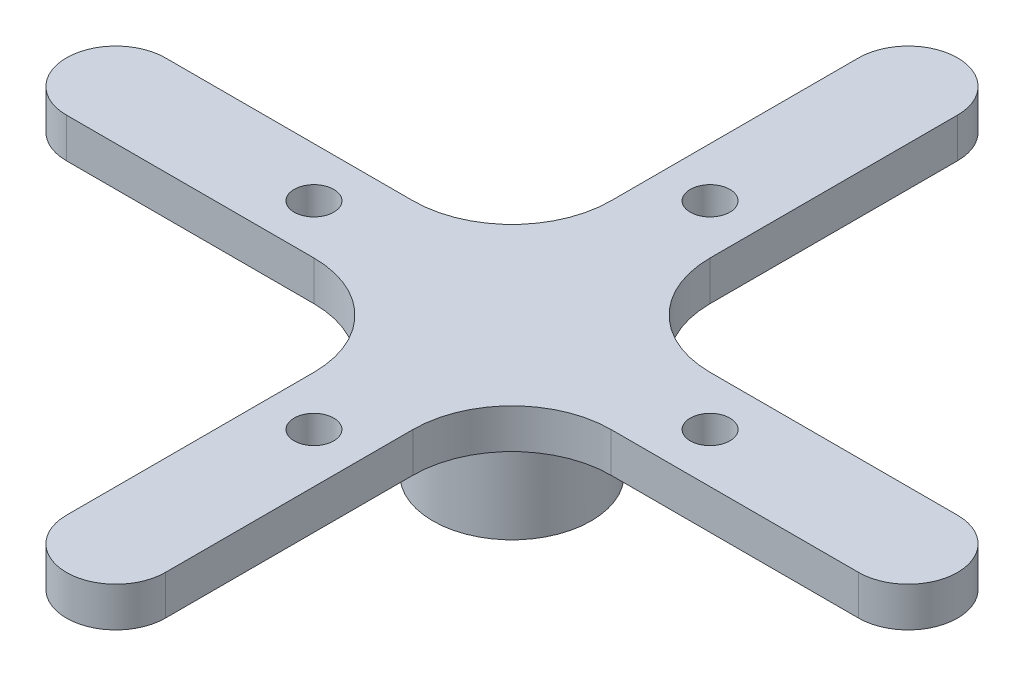
ISO-10303-21;
HEADER;
FILE_DESCRIPTION(('STEP AP214'),'2;1');
FILE_NAME('part.step','',(''),(''),'','','');
FILE_SCHEMA(('AUTOMOTIVE_DESIGN { 1 0 10303 214 1 1 1 1 }'));
ENDSEC;
DATA;
#1=APPLICATION_CONTEXT('core data for automotive mechanical design processes');
#2=APPLICATION_PROTOCOL_DEFINITION('international standard','automotive_design',2000,#1);
#3=PRODUCT_CONTEXT('',#1,'mechanical');
#4=PRODUCT('Part','Part','',(#3));
#5=PRODUCT_RELATED_PRODUCT_CATEGORY('part','',(#4));
#6=PRODUCT_DEFINITION_FORMATION('','',#4);
#7=PRODUCT_DEFINITION_CONTEXT('part definition',#1,'design');
#8=PRODUCT_DEFINITION('design','',#6,#7);
#9=PRODUCT_DEFINITION_SHAPE('','',#8);
#10=(LENGTH_UNIT() NAMED_UNIT(*) SI_UNIT(.MILLI.,.METRE.));
#11=(NAMED_UNIT(*) PLANE_ANGLE_UNIT() SI_UNIT($,.RADIAN.));
#12=(NAMED_UNIT(*) SI_UNIT($,.STERADIAN.) SOLID_ANGLE_UNIT());
#13=UNCERTAINTY_MEASURE_WITH_UNIT(LENGTH_MEASURE(1.E-05),#10,'distance_accuracy_value','');
#14=(GEOMETRIC_REPRESENTATION_CONTEXT(3) GLOBAL_UNCERTAINTY_ASSIGNED_CONTEXT((#13)) GLOBAL_UNIT_ASSIGNED_CONTEXT((#10,
#11,#12)) REPRESENTATION_CONTEXT('',''));
#15=CARTESIAN_POINT('',(0.,0.,0.));
#16=DIRECTION('',(0.,0.,1.));
#17=DIRECTION('',(1.,0.,0.));
#18=AXIS2_PLACEMENT_3D('',#15,#16,#17);
#19=CARTESIAN_POINT('',(-20.,0.,0.));
#20=DIRECTION('',(0.,1.,0.));
#21=DIRECTION('',(0.,0.,1.));
#22=AXIS2_PLACEMENT_3D('',#19,#20,#21);
#23=PLANE('',#22);
#24=CARTESIAN_POINT('',(0.,0.,-10.));
#25=DIRECTION('',(0.,1.,0.));
#26=DIRECTION('',(0.,0.,1.));
#27=AXIS2_PLACEMENT_3D('',#24,#25,#26);
#28=CIRCLE('',#27,1.);
#29=CARTESIAN_POINT('',(0.,0.,-9.));
#30=VERTEX_POINT('',#29);
#31=EDGE_CURVE('E511',#30,#30,#28,.T.);
#32=ORIENTED_EDGE('',*,*,#31,.T.);
#33=EDGE_LOOP('',(#32));
#34=FACE_BOUND('',#33,.T.);
#35=CARTESIAN_POINT('',(10.,0.,0.));
#36=DIRECTION('',(0.,1.,0.));
#37=DIRECTION('',(0.,0.,1.));
#38=AXIS2_PLACEMENT_3D('',#35,#36,#37);
#39=CIRCLE('',#38,1.);
#40=CARTESIAN_POINT('',(10.,0.,1.));
#41=VERTEX_POINT('',#40);
#42=EDGE_CURVE('E522',#41,#41,#39,.T.);
#43=ORIENTED_EDGE('',*,*,#42,.T.);
#44=EDGE_LOOP('',(#43));
#45=FACE_BOUND('',#44,.T.);
#46=CARTESIAN_POINT('',(-20.,0.,0.));
#47=DIRECTION('',(0.,1.,0.));
#48=DIRECTION('',(0.,0.,1.));
#49=AXIS2_PLACEMENT_3D('',#46,#47,#48);
#50=CIRCLE('',#49,2.5);
#51=CARTESIAN_POINT('',(-20.,0.,-2.5));
#52=VERTEX_POINT('',#51);
#53=CARTESIAN_POINT('',(-20.,0.,2.5));
#54=VERTEX_POINT('',#53);
#55=EDGE_CURVE('E389',#52,#54,#50,.T.);
#56=ORIENTED_EDGE('',*,*,#55,.F.);
#57=DIRECTION('',(1.,0.,0.));
#58=VECTOR('',#57,1.);
#59=CARTESIAN_POINT('',(-20.,0.,-2.5));
#60=LINE('',#59,#58);
#61=CARTESIAN_POINT('',(-7.50000000000004,0.,-2.5));
#62=VERTEX_POINT('',#61);
#63=EDGE_CURVE('E430',#52,#62,#60,.T.);
#64=ORIENTED_EDGE('',*,*,#63,.T.);
#65=CARTESIAN_POINT('',(-7.5,0.,-7.5));
#66=DIRECTION('',(0.,1.,0.));
#67=DIRECTION('',(0.,0.,1.));
#68=AXIS2_PLACEMENT_3D('',#65,#66,#67);
#69=CIRCLE('',#68,5.);
#70=CARTESIAN_POINT('',(-2.5,0.,-7.50000000000003));
#71=VERTEX_POINT('',#70);
#72=EDGE_CURVE('E428',#62,#71,#69,.T.);
#73=ORIENTED_EDGE('',*,*,#72,.T.);
#74=DIRECTION('',(0.,0.,1.));
#75=VECTOR('',#74,1.);
#76=CARTESIAN_POINT('',(-2.5,0.,-20.));
#77=LINE('',#76,#75);
#78=CARTESIAN_POINT('',(-2.5,0.,-20.));
#79=VERTEX_POINT('',#78);
#80=EDGE_CURVE('E378',#79,#71,#77,.T.);
#81=ORIENTED_EDGE('',*,*,#80,.F.);
#82=CARTESIAN_POINT('',(0.,0.,-20.));
#83=DIRECTION('',(0.,-1.,0.));
#84=DIRECTION('',(0.,0.,-1.));
#85=AXIS2_PLACEMENT_3D('',#82,#83,#84);
#86=CIRCLE('',#85,2.5);
#87=CARTESIAN_POINT('',(2.5,0.,-20.));
#88=VERTEX_POINT('',#87);
#89=EDGE_CURVE('E424',#79,#88,#86,.T.);
#90=ORIENTED_EDGE('',*,*,#89,.T.);
#91=DIRECTION('',(0.,0.,1.));
#92=VECTOR('',#91,1.);
#93=CARTESIAN_POINT('',(2.5,0.,-20.));
#94=LINE('',#93,#92);
#95=CARTESIAN_POINT('',(2.50000000000001,0.,-7.50000000000002));
#96=VERTEX_POINT('',#95);
#97=EDGE_CURVE('E421',#88,#96,#94,.T.);
#98=ORIENTED_EDGE('',*,*,#97,.T.);
#99=CARTESIAN_POINT('',(7.5,0.,-7.5));
#100=DIRECTION('',(0.,1.,0.));
#101=DIRECTION('',(0.,0.,1.));
#102=AXIS2_PLACEMENT_3D('',#99,#100,#101);
#103=CIRCLE('',#102,4.99999999999999);
#104=CARTESIAN_POINT('',(7.49999999999999,0.,-2.50000000000001));
#105=VERTEX_POINT('',#104);
#106=EDGE_CURVE('E418',#96,#105,#103,.T.);
#107=ORIENTED_EDGE('',*,*,#106,.T.);
#108=DIRECTION('',(1.,0.,0.));
#109=VECTOR('',#108,1.);
#110=CARTESIAN_POINT('',(7.49999999999999,0.,-2.50000000000001));
#111=LINE('',#110,#109);
#112=CARTESIAN_POINT('',(20.,0.,-2.5));
#113=VERTEX_POINT('',#112);
#114=EDGE_CURVE('E415',#105,#113,#111,.T.);
#115=ORIENTED_EDGE('',*,*,#114,.T.);
#116=CARTESIAN_POINT('',(20.,0.,0.));
#117=DIRECTION('',(0.,-1.,0.));
#118=DIRECTION('',(0.,0.,-1.));
#119=AXIS2_PLACEMENT_3D('',#116,#117,#118);
#120=CIRCLE('',#119,2.5);
#121=CARTESIAN_POINT('',(20.,0.,2.5));
#122=VERTEX_POINT('',#121);
#123=EDGE_CURVE('E412',#113,#122,#120,.T.);
#124=ORIENTED_EDGE('',*,*,#123,.T.);
#125=DIRECTION('',(1.,0.,0.));
#126=VECTOR('',#125,1.);
#127=CARTESIAN_POINT('',(7.50000000000004,0.,2.5));
#128=LINE('',#127,#126);
#129=CARTESIAN_POINT('',(7.50000000000004,0.,2.5));
#130=VERTEX_POINT('',#129);
#131=EDGE_CURVE('E409',#130,#122,#128,.T.);
#132=ORIENTED_EDGE('',*,*,#131,.F.);
#133=CARTESIAN_POINT('',(7.5,0.,7.5));
#134=DIRECTION('',(0.,1.,0.));
#135=DIRECTION('',(0.,0.,1.));
#136=AXIS2_PLACEMENT_3D('',#133,#134,#135);
#137=CIRCLE('',#136,5.);
#138=CARTESIAN_POINT('',(2.5,0.,7.50000000000004));
#139=VERTEX_POINT('',#138);
#140=EDGE_CURVE('E406',#130,#139,#137,.T.);
#141=ORIENTED_EDGE('',*,*,#140,.T.);
#142=DIRECTION('',(0.,0.,1.));
#143=VECTOR('',#142,1.);
#144=CARTESIAN_POINT('',(2.5,0.,7.50000000000004));
#145=LINE('',#144,#143);
#146=CARTESIAN_POINT('',(2.5,0.,20.));
#147=VERTEX_POINT('',#146);
#148=EDGE_CURVE('E403',#139,#147,#145,.T.);
#149=ORIENTED_EDGE('',*,*,#148,.T.);
#150=CARTESIAN_POINT('',(0.,0.,20.));
#151=DIRECTION('',(0.,1.,0.));
#152=DIRECTION('',(0.,0.,1.));
#153=AXIS2_PLACEMENT_3D('',#150,#151,#152);
#154=CIRCLE('',#153,2.5);
#155=CARTESIAN_POINT('',(-2.5,0.,20.));
#156=VERTEX_POINT('',#155);
#157=EDGE_CURVE('E400',#156,#147,#154,.T.);
#158=ORIENTED_EDGE('',*,*,#157,.F.);
#159=DIRECTION('',(0.,0.,1.));
#160=VECTOR('',#159,1.);
#161=CARTESIAN_POINT('',(-2.5,0.,7.50000000000003));
#162=LINE('',#161,#160);
#163=CARTESIAN_POINT('',(-2.5,0.,7.50000000000003));
#164=VERTEX_POINT('',#163);
#165=EDGE_CURVE('E398',#164,#156,#162,.T.);
#166=ORIENTED_EDGE('',*,*,#165,.F.);
#167=CARTESIAN_POINT('',(-7.5,0.,7.5));
#168=DIRECTION('',(0.,1.,0.));
#169=DIRECTION('',(0.,0.,1.));
#170=AXIS2_PLACEMENT_3D('',#167,#168,#169);
#171=CIRCLE('',#170,5.);
#172=CARTESIAN_POINT('',(-7.50000000000004,0.,2.5));
#173=VERTEX_POINT('',#172);
#174=EDGE_CURVE('E395',#164,#173,#171,.T.);
#175=ORIENTED_EDGE('',*,*,#174,.T.);
#176=DIRECTION('',(1.,0.,0.));
#177=VECTOR('',#176,1.);
#178=CARTESIAN_POINT('',(-20.,0.,2.5));
#179=LINE('',#178,#177);
#180=EDGE_CURVE('E391',#54,#173,#179,.T.);
#181=ORIENTED_EDGE('',*,*,#180,.F.);
#182=EDGE_LOOP('',(#56,#64,#73,#81,#90,#98,#107,#115,#124,#132,#141,#149,#158,#166,#175,#181));
#183=FACE_BOUND('',#182,.T.);
#184=CARTESIAN_POINT('',(0.,0.,10.));
#185=DIRECTION('',(0.,1.,0.));
#186=DIRECTION('',(0.,0.,1.));
#187=AXIS2_PLACEMENT_3D('',#184,#185,#186);
#188=CIRCLE('',#187,1.);
#189=CARTESIAN_POINT('',(0.,0.,11.));
#190=VERTEX_POINT('',#189);
#191=EDGE_CURVE('E517',#190,#190,#188,.T.);
#192=ORIENTED_EDGE('',*,*,#191,.T.);
#193=EDGE_LOOP('',(#192));
#194=FACE_BOUND('',#193,.T.);
#195=CARTESIAN_POINT('',(-10.,0.,0.));
#196=DIRECTION('',(0.,1.,0.));
#197=DIRECTION('',(0.,0.,1.));
#198=AXIS2_PLACEMENT_3D('',#195,#196,#197);
#199=CIRCLE('',#198,1.);
#200=CARTESIAN_POINT('',(-10.,0.,1.));
#201=VERTEX_POINT('',#200);
#202=EDGE_CURVE('E507',#201,#201,#199,.T.);
#203=ORIENTED_EDGE('',*,*,#202,.T.);
#204=EDGE_LOOP('',(#203));
#205=FACE_BOUND('',#204,.T.);
#206=CARTESIAN_POINT('',(0.,0.,0.));
#207=DIRECTION('',(0.,1.,0.));
#208=DIRECTION('',(0.,0.,1.));
#209=AXIS2_PLACEMENT_3D('',#206,#207,#208);
#210=CIRCLE('',#209,4.);
#211=CARTESIAN_POINT('',(0.,0.,4.));
#212=VERTEX_POINT('',#211);
#213=EDGE_CURVE('E12',#212,#212,#210,.F.);
#214=ORIENTED_EDGE('',*,*,#213,.F.);
#215=EDGE_LOOP('',(#214));
#216=FACE_BOUND('',#215,.T.);
#217=ADVANCED_FACE('F241',(#34,#45,#183,#194,#205,#216),#23,.F.);
#218=CARTESIAN_POINT('',(-20.,2.,0.));
#219=DIRECTION('',(0.,1.,0.));
#220=DIRECTION('',(0.,0.,1.));
#221=AXIS2_PLACEMENT_3D('',#218,#219,#220);
#222=PLANE('',#221);
#223=CARTESIAN_POINT('',(0.,2.,-10.));
#224=DIRECTION('',(0.,1.,0.));
#225=DIRECTION('',(0.,0.,1.));
#226=AXIS2_PLACEMENT_3D('',#223,#224,#225);
#227=CIRCLE('',#226,1.);
#228=CARTESIAN_POINT('',(0.,2.,-9.));
#229=VERTEX_POINT('',#228);
#230=EDGE_CURVE('E514',#229,#229,#227,.T.);
#231=ORIENTED_EDGE('',*,*,#230,.F.);
#232=EDGE_LOOP('',(#231));
#233=FACE_BOUND('',#232,.T.);
#234=CARTESIAN_POINT('',(10.,2.,0.));
#235=DIRECTION('',(0.,1.,0.));
#236=DIRECTION('',(0.,0.,1.));
#237=AXIS2_PLACEMENT_3D('',#234,#235,#236);
#238=CIRCLE('',#237,1.);
#239=CARTESIAN_POINT('',(10.,2.,1.));
#240=VERTEX_POINT('',#239);
#241=EDGE_CURVE('E392',#240,#240,#238,.T.);
#242=ORIENTED_EDGE('',*,*,#241,.F.);
#243=EDGE_LOOP('',(#242));
#244=FACE_BOUND('',#243,.T.);
#245=CARTESIAN_POINT('',(-20.,2.,0.));
#246=DIRECTION('',(0.,1.,0.));
#247=DIRECTION('',(0.,0.,1.));
#248=AXIS2_PLACEMENT_3D('',#245,#246,#247);
#249=CIRCLE('',#248,2.5);
#250=CARTESIAN_POINT('',(-20.,2.,-2.5));
#251=VERTEX_POINT('',#250);
#252=CARTESIAN_POINT('',(-20.,2.,2.5));
#253=VERTEX_POINT('',#252);
#254=EDGE_CURVE('E433',#251,#253,#249,.T.);
#255=ORIENTED_EDGE('',*,*,#254,.T.);
#256=DIRECTION('',(1.,0.,0.));
#257=VECTOR('',#256,1.);
#258=CARTESIAN_POINT('',(-20.,2.,2.5));
#259=LINE('',#258,#257);
#260=CARTESIAN_POINT('',(-7.50000000000004,2.,2.5));
#261=VERTEX_POINT('',#260);
#262=EDGE_CURVE('E321',#253,#261,#259,.T.);
#263=ORIENTED_EDGE('',*,*,#262,.T.);
#264=CARTESIAN_POINT('',(-7.5,2.,7.5));
#265=DIRECTION('',(0.,1.,0.));
#266=DIRECTION('',(0.,0.,1.));
#267=AXIS2_PLACEMENT_3D('',#264,#265,#266);
#268=CIRCLE('',#267,5.);
#269=CARTESIAN_POINT('',(-2.5,2.,7.50000000000003));
#270=VERTEX_POINT('',#269);
#271=EDGE_CURVE('E531',#270,#261,#268,.T.);
#272=ORIENTED_EDGE('',*,*,#271,.F.);
#273=DIRECTION('',(0.,0.,1.));
#274=VECTOR('',#273,1.);
#275=CARTESIAN_POINT('',(-2.5,2.,7.50000000000003));
#276=LINE('',#275,#274);
#277=CARTESIAN_POINT('',(-2.5,2.,20.));
#278=VERTEX_POINT('',#277);
#279=EDGE_CURVE('E534',#270,#278,#276,.T.);
#280=ORIENTED_EDGE('',*,*,#279,.T.);
#281=CARTESIAN_POINT('',(0.,2.,20.));
#282=DIRECTION('',(0.,1.,0.));
#283=DIRECTION('',(0.,0.,1.));
#284=AXIS2_PLACEMENT_3D('',#281,#282,#283);
#285=CIRCLE('',#284,2.5);
#286=CARTESIAN_POINT('',(2.5,2.,20.));
#287=VERTEX_POINT('',#286);
#288=EDGE_CURVE('E536',#278,#287,#285,.T.);
#289=ORIENTED_EDGE('',*,*,#288,.T.);
#290=DIRECTION('',(0.,0.,1.));
#291=VECTOR('',#290,1.);
#292=CARTESIAN_POINT('',(2.5,2.,7.50000000000004));
#293=LINE('',#292,#291);
#294=CARTESIAN_POINT('',(2.5,2.,7.50000000000004));
#295=VERTEX_POINT('',#294);
#296=EDGE_CURVE('E538',#295,#287,#293,.T.);
#297=ORIENTED_EDGE('',*,*,#296,.F.);
#298=CARTESIAN_POINT('',(7.5,2.,7.5));
#299=DIRECTION('',(0.,1.,0.));
#300=DIRECTION('',(0.,0.,1.));
#301=AXIS2_PLACEMENT_3D('',#298,#299,#300);
#302=CIRCLE('',#301,5.);
#303=CARTESIAN_POINT('',(7.50000000000004,2.,2.5));
#304=VERTEX_POINT('',#303);
#305=EDGE_CURVE('E541',#304,#295,#302,.T.);
#306=ORIENTED_EDGE('',*,*,#305,.F.);
#307=DIRECTION('',(1.,0.,0.));
#308=VECTOR('',#307,1.);
#309=CARTESIAN_POINT('',(7.50000000000004,2.,2.5));
#310=LINE('',#309,#308);
#311=CARTESIAN_POINT('',(20.,2.,2.5));
#312=VERTEX_POINT('',#311);
#313=EDGE_CURVE('E544',#304,#312,#310,.T.);
#314=ORIENTED_EDGE('',*,*,#313,.T.);
#315=CARTESIAN_POINT('',(20.,2.,0.));
#316=DIRECTION('',(0.,-1.,0.));
#317=DIRECTION('',(0.,0.,-1.));
#318=AXIS2_PLACEMENT_3D('',#315,#316,#317);
#319=CIRCLE('',#318,2.5);
#320=CARTESIAN_POINT('',(20.,2.,-2.5));
#321=VERTEX_POINT('',#320);
#322=EDGE_CURVE('E546',#321,#312,#319,.T.);
#323=ORIENTED_EDGE('',*,*,#322,.F.);
#324=DIRECTION('',(1.,0.,0.));
#325=VECTOR('',#324,1.);
#326=CARTESIAN_POINT('',(7.49999999999999,2.,-2.50000000000001));
#327=LINE('',#326,#325);
#328=CARTESIAN_POINT('',(7.49999999999999,2.,-2.50000000000001));
#329=VERTEX_POINT('',#328);
#330=EDGE_CURVE('E549',#329,#321,#327,.T.);
#331=ORIENTED_EDGE('',*,*,#330,.F.);
#332=CARTESIAN_POINT('',(7.5,2.,-7.5));
#333=DIRECTION('',(0.,1.,0.));
#334=DIRECTION('',(0.,0.,1.));
#335=AXIS2_PLACEMENT_3D('',#332,#333,#334);
#336=CIRCLE('',#335,4.99999999999999);
#337=CARTESIAN_POINT('',(2.50000000000001,2.,-7.50000000000002));
#338=VERTEX_POINT('',#337);
#339=EDGE_CURVE('E552',#338,#329,#336,.T.);
#340=ORIENTED_EDGE('',*,*,#339,.F.);
#341=DIRECTION('',(0.,0.,1.));
#342=VECTOR('',#341,1.);
#343=CARTESIAN_POINT('',(2.5,2.,-20.));
#344=LINE('',#343,#342);
#345=CARTESIAN_POINT('',(2.5,2.,-20.));
#346=VERTEX_POINT('',#345);
#347=EDGE_CURVE('E555',#346,#338,#344,.T.);
#348=ORIENTED_EDGE('',*,*,#347,.F.);
#349=CARTESIAN_POINT('',(0.,2.,-20.));
#350=DIRECTION('',(0.,-1.,0.));
#351=DIRECTION('',(0.,0.,-1.));
#352=AXIS2_PLACEMENT_3D('',#349,#350,#351);
#353=CIRCLE('',#352,2.5);
#354=CARTESIAN_POINT('',(-2.5,2.,-20.));
#355=VERTEX_POINT('',#354);
#356=EDGE_CURVE('E371',#355,#346,#353,.T.);
#357=ORIENTED_EDGE('',*,*,#356,.F.);
#358=DIRECTION('',(0.,0.,1.));
#359=VECTOR('',#358,1.);
#360=CARTESIAN_POINT('',(-2.5,2.,-20.));
#361=LINE('',#360,#359);
#362=CARTESIAN_POINT('',(-2.5,2.,-7.50000000000003));
#363=VERTEX_POINT('',#362);
#364=EDGE_CURVE('E362',#355,#363,#361,.T.);
#365=ORIENTED_EDGE('',*,*,#364,.T.);
#366=CARTESIAN_POINT('',(-7.5,2.,-7.5));
#367=DIRECTION('',(0.,1.,0.));
#368=DIRECTION('',(0.,0.,1.));
#369=AXIS2_PLACEMENT_3D('',#366,#367,#368);
#370=CIRCLE('',#369,5.);
#371=CARTESIAN_POINT('',(-7.50000000000004,2.,-2.5));
#372=VERTEX_POINT('',#371);
#373=EDGE_CURVE('E368',#372,#363,#370,.T.);
#374=ORIENTED_EDGE('',*,*,#373,.F.);
#375=DIRECTION('',(1.,0.,0.));
#376=VECTOR('',#375,1.);
#377=CARTESIAN_POINT('',(-20.,2.,-2.5));
#378=LINE('',#377,#376);
#379=EDGE_CURVE('E384',#251,#372,#378,.T.);
#380=ORIENTED_EDGE('',*,*,#379,.F.);
#381=EDGE_LOOP('',(#255,#263,#272,#280,#289,#297,#306,#314,#323,#331,#340,#348,#357,#365,#374,#380));
#382=FACE_BOUND('',#381,.T.);
#383=CARTESIAN_POINT('',(0.,2.,10.));
#384=DIRECTION('',(0.,1.,0.));
#385=DIRECTION('',(0.,0.,1.));
#386=AXIS2_PLACEMENT_3D('',#383,#384,#385);
#387=CIRCLE('',#386,1.);
#388=CARTESIAN_POINT('',(0.,2.,11.));
#389=VERTEX_POINT('',#388);
#390=EDGE_CURVE('E519',#389,#389,#387,.T.);
#391=ORIENTED_EDGE('',*,*,#390,.F.);
#392=EDGE_LOOP('',(#391));
#393=FACE_BOUND('',#392,.T.);
#394=CARTESIAN_POINT('',(-10.,2.,0.));
#395=DIRECTION('',(0.,1.,0.));
#396=DIRECTION('',(0.,0.,1.));
#397=AXIS2_PLACEMENT_3D('',#394,#395,#396);
#398=CIRCLE('',#397,1.);
#399=CARTESIAN_POINT('',(-10.,2.,1.));
#400=VERTEX_POINT('',#399);
#401=EDGE_CURVE('E508',#400,#400,#398,.T.);
#402=ORIENTED_EDGE('',*,*,#401,.F.);
#403=EDGE_LOOP('',(#402));
#404=FACE_BOUND('',#403,.T.);
#405=ADVANCED_FACE('F364',(#233,#244,#382,#393,#404),#222,.T.);
#406=CARTESIAN_POINT('',(-20.,2.,0.));
#407=DIRECTION('',(0.,-1.,0.));
#408=DIRECTION('',(0.,0.,-1.));
#409=AXIS2_PLACEMENT_3D('',#406,#407,#408);
#410=CYLINDRICAL_SURFACE('',#409,2.5);
#411=ORIENTED_EDGE('',*,*,#55,.T.);
#412=DIRECTION('',(0.,-1.,0.));
#413=VECTOR('',#412,1.);
#414=CARTESIAN_POINT('',(-20.,2.,2.5));
#415=LINE('',#414,#413);
#416=EDGE_CURVE('E250',#253,#54,#415,.T.);
#417=ORIENTED_EDGE('',*,*,#416,.F.);
#418=ORIENTED_EDGE('',*,*,#254,.F.);
#419=DIRECTION('',(0.,-1.,0.));
#420=VECTOR('',#419,1.);
#421=CARTESIAN_POINT('',(-20.,2.,-2.5));
#422=LINE('',#421,#420);
#423=EDGE_CURVE('E258',#251,#52,#422,.T.);
#424=ORIENTED_EDGE('',*,*,#423,.T.);
#425=EDGE_LOOP('',(#411,#417,#418,#424));
#426=FACE_BOUND('',#425,.T.);
#427=ADVANCED_FACE('F243',(#426),#410,.T.);
#428=CARTESIAN_POINT('',(-20.,2.,2.5));
#429=DIRECTION('',(0.,0.,-1.));
#430=DIRECTION('',(-1.,0.,0.));
#431=AXIS2_PLACEMENT_3D('',#428,#429,#430);
#432=PLANE('',#431);
#433=ORIENTED_EDGE('',*,*,#180,.T.);
#434=DIRECTION('',(0.,-1.,0.));
#435=VECTOR('',#434,1.);
#436=CARTESIAN_POINT('',(-7.50000000000004,2.,2.5));
#437=LINE('',#436,#435);
#438=EDGE_CURVE('E458',#261,#173,#437,.T.);
#439=ORIENTED_EDGE('',*,*,#438,.F.);
#440=ORIENTED_EDGE('',*,*,#262,.F.);
#441=ORIENTED_EDGE('',*,*,#416,.T.);
#442=EDGE_LOOP('',(#433,#439,#440,#441));
#443=FACE_BOUND('',#442,.T.);
#444=ADVANCED_FACE('F460',(#443),#432,.F.);
#445=CARTESIAN_POINT('',(-7.5,2.,7.5));
#446=DIRECTION('',(0.,-1.,0.));
#447=DIRECTION('',(0.,0.,-1.));
#448=AXIS2_PLACEMENT_3D('',#445,#446,#447);
#449=CYLINDRICAL_SURFACE('',#448,5.);
#450=ORIENTED_EDGE('',*,*,#174,.F.);
#451=DIRECTION('',(0.,-1.,0.));
#452=VECTOR('',#451,1.);
#453=CARTESIAN_POINT('',(-2.5,2.,7.50000000000003));
#454=LINE('',#453,#452);
#455=EDGE_CURVE('E456',#270,#164,#454,.T.);
#456=ORIENTED_EDGE('',*,*,#455,.F.);
#457=ORIENTED_EDGE('',*,*,#271,.T.);
#458=ORIENTED_EDGE('',*,*,#438,.T.);
#459=EDGE_LOOP('',(#450,#456,#457,#458));
#460=FACE_BOUND('',#459,.T.);
#461=ADVANCED_FACE('F601',(#460),#449,.F.);
#462=CARTESIAN_POINT('',(-2.5,2.,7.50000000000003));
#463=DIRECTION('',(1.,0.,0.));
#464=DIRECTION('',(0.,0.,-1.));
#465=AXIS2_PLACEMENT_3D('',#462,#463,#464);
#466=PLANE('',#465);
#467=ORIENTED_EDGE('',*,*,#165,.T.);
#468=DIRECTION('',(0.,-1.,0.));
#469=VECTOR('',#468,1.);
#470=CARTESIAN_POINT('',(-2.5,2.,20.));
#471=LINE('',#470,#469);
#472=EDGE_CURVE('E453',#278,#156,#471,.T.);
#473=ORIENTED_EDGE('',*,*,#472,.F.);
#474=ORIENTED_EDGE('',*,*,#279,.F.);
#475=ORIENTED_EDGE('',*,*,#455,.T.);
#476=EDGE_LOOP('',(#467,#473,#474,#475));
#477=FACE_BOUND('',#476,.T.);
#478=ADVANCED_FACE('F597',(#477),#466,.F.);
#479=CARTESIAN_POINT('',(0.,2.,20.));
#480=DIRECTION('',(0.,-1.,0.));
#481=DIRECTION('',(0.,0.,-1.));
#482=AXIS2_PLACEMENT_3D('',#479,#480,#481);
#483=CYLINDRICAL_SURFACE('',#482,2.5);
#484=ORIENTED_EDGE('',*,*,#157,.T.);
#485=DIRECTION('',(0.,-1.,0.));
#486=VECTOR('',#485,1.);
#487=CARTESIAN_POINT('',(2.5,2.,20.));
#488=LINE('',#487,#486);
#489=EDGE_CURVE('E451',#287,#147,#488,.T.);
#490=ORIENTED_EDGE('',*,*,#489,.F.);
#491=ORIENTED_EDGE('',*,*,#288,.F.);
#492=ORIENTED_EDGE('',*,*,#472,.T.);
#493=EDGE_LOOP('',(#484,#490,#491,#492));
#494=FACE_BOUND('',#493,.T.);
#495=ADVANCED_FACE('F593',(#494),#483,.T.);
#496=CARTESIAN_POINT('',(2.5,2.,7.50000000000004));
#497=DIRECTION('',(1.,0.,0.));
#498=DIRECTION('',(0.,0.,-1.));
#499=AXIS2_PLACEMENT_3D('',#496,#497,#498);
#500=PLANE('',#499);
#501=ORIENTED_EDGE('',*,*,#148,.F.);
#502=DIRECTION('',(0.,-1.,0.));
#503=VECTOR('',#502,1.);
#504=CARTESIAN_POINT('',(2.5,2.,7.50000000000004));
#505=LINE('',#504,#503);
#506=EDGE_CURVE('E449',#295,#139,#505,.T.);
#507=ORIENTED_EDGE('',*,*,#506,.F.);
#508=ORIENTED_EDGE('',*,*,#296,.T.);
#509=ORIENTED_EDGE('',*,*,#489,.T.);
#510=EDGE_LOOP('',(#501,#507,#508,#509));
#511=FACE_BOUND('',#510,.T.);
#512=ADVANCED_FACE('F588',(#511),#500,.T.);
#513=CARTESIAN_POINT('',(7.5,2.,7.5));
#514=DIRECTION('',(0.,-1.,0.));
#515=DIRECTION('',(0.,0.,-1.));
#516=AXIS2_PLACEMENT_3D('',#513,#514,#515);
#517=CYLINDRICAL_SURFACE('',#516,5.);
#518=ORIENTED_EDGE('',*,*,#140,.F.);
#519=DIRECTION('',(0.,-1.,0.));
#520=VECTOR('',#519,1.);
#521=CARTESIAN_POINT('',(7.50000000000004,2.,2.5));
#522=LINE('',#521,#520);
#523=EDGE_CURVE('E447',#304,#130,#522,.T.);
#524=ORIENTED_EDGE('',*,*,#523,.F.);
#525=ORIENTED_EDGE('',*,*,#305,.T.);
#526=ORIENTED_EDGE('',*,*,#506,.T.);
#527=EDGE_LOOP('',(#518,#524,#525,#526));
#528=FACE_BOUND('',#527,.T.);
#529=ADVANCED_FACE('F583',(#528),#517,.F.);
#530=CARTESIAN_POINT('',(7.50000000000004,2.,2.5));
#531=DIRECTION('',(0.,0.,-1.));
#532=DIRECTION('',(-1.,0.,0.));
#533=AXIS2_PLACEMENT_3D('',#530,#531,#532);
#534=PLANE('',#533);
#535=ORIENTED_EDGE('',*,*,#131,.T.);
#536=DIRECTION('',(0.,-1.,0.));
#537=VECTOR('',#536,1.);
#538=CARTESIAN_POINT('',(20.,2.,2.5));
#539=LINE('',#538,#537);
#540=EDGE_CURVE('E445',#312,#122,#539,.T.);
#541=ORIENTED_EDGE('',*,*,#540,.F.);
#542=ORIENTED_EDGE('',*,*,#313,.F.);
#543=ORIENTED_EDGE('',*,*,#523,.T.);
#544=EDGE_LOOP('',(#535,#541,#542,#543));
#545=FACE_BOUND('',#544,.T.);
#546=ADVANCED_FACE('F580',(#545),#534,.F.);
#547=CARTESIAN_POINT('',(20.,2.,0.));
#548=DIRECTION('',(0.,-1.,0.));
#549=DIRECTION('',(0.,0.,-1.));
#550=AXIS2_PLACEMENT_3D('',#547,#548,#549);
#551=CYLINDRICAL_SURFACE('',#550,2.5);
#552=ORIENTED_EDGE('',*,*,#123,.F.);
#553=DIRECTION('',(0.,-1.,0.));
#554=VECTOR('',#553,1.);
#555=CARTESIAN_POINT('',(20.,2.,-2.5));
#556=LINE('',#555,#554);
#557=EDGE_CURVE('E443',#321,#113,#556,.T.);
#558=ORIENTED_EDGE('',*,*,#557,.F.);
#559=ORIENTED_EDGE('',*,*,#322,.T.);
#560=ORIENTED_EDGE('',*,*,#540,.T.);
#561=EDGE_LOOP('',(#552,#558,#559,#560));
#562=FACE_BOUND('',#561,.T.);
#563=ADVANCED_FACE('F575',(#562),#551,.T.);
#564=CARTESIAN_POINT('',(7.49999999999999,2.,-2.50000000000001));
#565=DIRECTION('',(0.,0.,-1.));
#566=DIRECTION('',(-1.,0.,0.));
#567=AXIS2_PLACEMENT_3D('',#564,#565,#566);
#568=PLANE('',#567);
#569=ORIENTED_EDGE('',*,*,#114,.F.);
#570=DIRECTION('',(0.,-1.,0.));
#571=VECTOR('',#570,1.);
#572=CARTESIAN_POINT('',(7.49999999999999,2.,-2.50000000000001));
#573=LINE('',#572,#571);
#574=EDGE_CURVE('E441',#329,#105,#573,.T.);
#575=ORIENTED_EDGE('',*,*,#574,.F.);
#576=ORIENTED_EDGE('',*,*,#330,.T.);
#577=ORIENTED_EDGE('',*,*,#557,.T.);
#578=EDGE_LOOP('',(#569,#575,#576,#577));
#579=FACE_BOUND('',#578,.T.);
#580=ADVANCED_FACE('F570',(#579),#568,.T.);
#581=CARTESIAN_POINT('',(7.5,2.,-7.5));
#582=DIRECTION('',(0.,-1.,0.));
#583=DIRECTION('',(0.,0.,-1.));
#584=AXIS2_PLACEMENT_3D('',#581,#582,#583);
#585=CYLINDRICAL_SURFACE('',#584,4.99999999999999);
#586=ORIENTED_EDGE('',*,*,#106,.F.);
#587=DIRECTION('',(0.,-1.,0.));
#588=VECTOR('',#587,1.);
#589=CARTESIAN_POINT('',(2.50000000000001,2.,-7.50000000000002));
#590=LINE('',#589,#588);
#591=EDGE_CURVE('E439',#338,#96,#590,.T.);
#592=ORIENTED_EDGE('',*,*,#591,.F.);
#593=ORIENTED_EDGE('',*,*,#339,.T.);
#594=ORIENTED_EDGE('',*,*,#574,.T.);
#595=EDGE_LOOP('',(#586,#592,#593,#594));
#596=FACE_BOUND('',#595,.T.);
#597=ADVANCED_FACE('F566',(#596),#585,.F.);
#598=CARTESIAN_POINT('',(2.5,2.,-20.));
#599=DIRECTION('',(1.,0.,0.));
#600=DIRECTION('',(0.,0.,-1.));
#601=AXIS2_PLACEMENT_3D('',#598,#599,#600);
#602=PLANE('',#601);
#603=ORIENTED_EDGE('',*,*,#97,.F.);
#604=DIRECTION('',(0.,-1.,0.));
#605=VECTOR('',#604,1.);
#606=CARTESIAN_POINT('',(2.5,2.,-20.));
#607=LINE('',#606,#605);
#608=EDGE_CURVE('E437',#346,#88,#607,.T.);
#609=ORIENTED_EDGE('',*,*,#608,.F.);
#610=ORIENTED_EDGE('',*,*,#347,.T.);
#611=ORIENTED_EDGE('',*,*,#591,.T.);
#612=EDGE_LOOP('',(#603,#609,#610,#611));
#613=FACE_BOUND('',#612,.T.);
#614=ADVANCED_FACE('F563',(#613),#602,.T.);
#615=CARTESIAN_POINT('',(0.,2.,-20.));
#616=DIRECTION('',(0.,-1.,0.));
#617=DIRECTION('',(0.,0.,-1.));
#618=AXIS2_PLACEMENT_3D('',#615,#616,#617);
#619=CYLINDRICAL_SURFACE('',#618,2.5);
#620=ORIENTED_EDGE('',*,*,#89,.F.);
#621=DIRECTION('',(0.,-1.,0.));
#622=VECTOR('',#621,1.);
#623=CARTESIAN_POINT('',(-2.5,2.,-20.));
#624=LINE('',#623,#622);
#625=EDGE_CURVE('E381',#355,#79,#624,.T.);
#626=ORIENTED_EDGE('',*,*,#625,.F.);
#627=ORIENTED_EDGE('',*,*,#356,.T.);
#628=ORIENTED_EDGE('',*,*,#608,.T.);
#629=EDGE_LOOP('',(#620,#626,#627,#628));
#630=FACE_BOUND('',#629,.T.);
#631=ADVANCED_FACE('F559',(#630),#619,.T.);
#632=CARTESIAN_POINT('',(-2.5,2.,-20.));
#633=DIRECTION('',(1.,0.,0.));
#634=DIRECTION('',(0.,0.,-1.));
#635=AXIS2_PLACEMENT_3D('',#632,#633,#634);
#636=PLANE('',#635);
#637=ORIENTED_EDGE('',*,*,#80,.T.);
#638=DIRECTION('',(0.,-1.,0.));
#639=VECTOR('',#638,1.);
#640=CARTESIAN_POINT('',(-2.5,2.,-7.50000000000003));
#641=LINE('',#640,#639);
#642=EDGE_CURVE('E375',#363,#71,#641,.T.);
#643=ORIENTED_EDGE('',*,*,#642,.F.);
#644=ORIENTED_EDGE('',*,*,#364,.F.);
#645=ORIENTED_EDGE('',*,*,#625,.T.);
#646=EDGE_LOOP('',(#637,#643,#644,#645));
#647=FACE_BOUND('',#646,.T.);
#648=ADVANCED_FACE('F376',(#647),#636,.F.);
#649=CARTESIAN_POINT('',(-7.5,2.,-7.5));
#650=DIRECTION('',(0.,-1.,0.));
#651=DIRECTION('',(0.,0.,-1.));
#652=AXIS2_PLACEMENT_3D('',#649,#650,#651);
#653=CYLINDRICAL_SURFACE('',#652,5.);
#654=ORIENTED_EDGE('',*,*,#72,.F.);
#655=DIRECTION('',(0.,-1.,0.));
#656=VECTOR('',#655,1.);
#657=CARTESIAN_POINT('',(-7.50000000000004,2.,-2.5));
#658=LINE('',#657,#656);
#659=EDGE_CURVE('E308',#372,#62,#658,.T.);
#660=ORIENTED_EDGE('',*,*,#659,.F.);
#661=ORIENTED_EDGE('',*,*,#373,.T.);
#662=ORIENTED_EDGE('',*,*,#642,.T.);
#663=EDGE_LOOP('',(#654,#660,#661,#662));
#664=FACE_BOUND('',#663,.T.);
#665=ADVANCED_FACE('F383',(#664),#653,.F.);
#666=CARTESIAN_POINT('',(-20.,2.,-2.5));
#667=DIRECTION('',(0.,0.,-1.));
#668=DIRECTION('',(-1.,0.,0.));
#669=AXIS2_PLACEMENT_3D('',#666,#667,#668);
#670=PLANE('',#669);
#671=ORIENTED_EDGE('',*,*,#63,.F.);
#672=ORIENTED_EDGE('',*,*,#423,.F.);
#673=ORIENTED_EDGE('',*,*,#379,.T.);
#674=ORIENTED_EDGE('',*,*,#659,.T.);
#675=EDGE_LOOP('',(#671,#672,#673,#674));
#676=FACE_BOUND('',#675,.T.);
#677=ADVANCED_FACE('F463',(#676),#670,.T.);
#678=CARTESIAN_POINT('',(10.,2.,0.));
#679=DIRECTION('',(0.,-1.,0.));
#680=DIRECTION('',(0.,0.,-1.));
#681=AXIS2_PLACEMENT_3D('',#678,#679,#680);
#682=CYLINDRICAL_SURFACE('',#681,1.);
#683=ORIENTED_EDGE('',*,*,#241,.T.);
#684=EDGE_LOOP('',(#683));
#685=FACE_BOUND('',#684,.T.);
#686=ORIENTED_EDGE('',*,*,#42,.F.);
#687=EDGE_LOOP('',(#686));
#688=FACE_BOUND('',#687,.T.);
#689=ADVANCED_FACE('F465',(#685,#688),#682,.F.);
#690=CARTESIAN_POINT('',(0.,2.,10.));
#691=DIRECTION('',(0.,-1.,0.));
#692=DIRECTION('',(0.,0.,-1.));
#693=AXIS2_PLACEMENT_3D('',#690,#691,#692);
#694=CYLINDRICAL_SURFACE('',#693,1.);
#695=ORIENTED_EDGE('',*,*,#390,.T.);
#696=EDGE_LOOP('',(#695));
#697=FACE_BOUND('',#696,.T.);
#698=ORIENTED_EDGE('',*,*,#191,.F.);
#699=EDGE_LOOP('',(#698));
#700=FACE_BOUND('',#699,.T.);
#701=ADVANCED_FACE('F471',(#697,#700),#694,.F.);
#702=CARTESIAN_POINT('',(0.,2.,-10.));
#703=DIRECTION('',(0.,-1.,0.));
#704=DIRECTION('',(0.,0.,-1.));
#705=AXIS2_PLACEMENT_3D('',#702,#703,#704);
#706=CYLINDRICAL_SURFACE('',#705,1.);
#707=ORIENTED_EDGE('',*,*,#230,.T.);
#708=EDGE_LOOP('',(#707));
#709=FACE_BOUND('',#708,.T.);
#710=ORIENTED_EDGE('',*,*,#31,.F.);
#711=EDGE_LOOP('',(#710));
#712=FACE_BOUND('',#711,.T.);
#713=ADVANCED_FACE('F656',(#709,#712),#706,.F.);
#714=CARTESIAN_POINT('',(-10.,2.,0.));
#715=DIRECTION('',(0.,-1.,0.));
#716=DIRECTION('',(0.,0.,-1.));
#717=AXIS2_PLACEMENT_3D('',#714,#715,#716);
#718=CYLINDRICAL_SURFACE('',#717,1.);
#719=ORIENTED_EDGE('',*,*,#401,.T.);
#720=EDGE_LOOP('',(#719));
#721=FACE_BOUND('',#720,.T.);
#722=ORIENTED_EDGE('',*,*,#202,.F.);
#723=EDGE_LOOP('',(#722));
#724=FACE_BOUND('',#723,.T.);
#725=ADVANCED_FACE('F666',(#721,#724),#718,.F.);
#726=CARTESIAN_POINT('',(0.,-5.,0.));
#727=DIRECTION('',(0.,-1.,0.));
#728=DIRECTION('',(0.,0.,-1.));
#729=AXIS2_PLACEMENT_3D('',#726,#727,#728);
#730=PLANE('',#729);
#731=CARTESIAN_POINT('',(0.,-5.,0.));
#732=DIRECTION('',(0.,-1.,0.));
#733=DIRECTION('',(0.,0.,-1.));
#734=AXIS2_PLACEMENT_3D('',#731,#732,#733);
#735=CIRCLE('',#734,4.);
#736=CARTESIAN_POINT('',(0.,-5.,-4.));
#737=VERTEX_POINT('',#736);
#738=EDGE_CURVE('E502',#737,#737,#735,.T.);
#739=ORIENTED_EDGE('',*,*,#738,.T.);
#740=EDGE_LOOP('',(#739));
#741=FACE_BOUND('',#740,.T.);
#742=CARTESIAN_POINT('',(0.,-5.,0.));
#743=DIRECTION('',(0.,-1.,0.));
#744=DIRECTION('',(0.,0.,-1.));
#745=AXIS2_PLACEMENT_3D('',#742,#743,#744);
#746=CIRCLE('',#745,2.95);
#747=CARTESIAN_POINT('',(0.,-5.,-2.95));
#748=VERTEX_POINT('',#747);
#749=EDGE_CURVE('E499',#748,#748,#746,.T.);
#750=ORIENTED_EDGE('',*,*,#749,.F.);
#751=EDGE_LOOP('',(#750));
#752=FACE_BOUND('',#751,.T.);
#753=ADVANCED_FACE('F675',(#741,#752),#730,.T.);
#754=CARTESIAN_POINT('',(0.,-5.,0.));
#755=DIRECTION('',(0.,1.,0.));
#756=DIRECTION('',(0.,0.,1.));
#757=AXIS2_PLACEMENT_3D('',#754,#755,#756);
#758=CYLINDRICAL_SURFACE('',#757,4.);
#759=ORIENTED_EDGE('',*,*,#738,.F.);
#760=EDGE_LOOP('',(#759));
#761=FACE_BOUND('',#760,.T.);
#762=ORIENTED_EDGE('',*,*,#213,.T.);
#763=EDGE_LOOP('',(#762));
#764=FACE_BOUND('',#763,.T.);
#765=ADVANCED_FACE('F492',(#761,#764),#758,.T.);
#766=CARTESIAN_POINT('',(0.,-5.,0.));
#767=DIRECTION('',(0.,1.,0.));
#768=DIRECTION('',(0.,0.,1.));
#769=AXIS2_PLACEMENT_3D('',#766,#767,#768);
#770=CYLINDRICAL_SURFACE('',#769,2.95);
#771=ORIENTED_EDGE('',*,*,#749,.T.);
#772=EDGE_LOOP('',(#771));
#773=FACE_BOUND('',#772,.T.);
#774=CARTESIAN_POINT('',(0.,0.,0.));
#775=DIRECTION('',(0.,-1.,0.));
#776=DIRECTION('',(0.,0.,-1.));
#777=AXIS2_PLACEMENT_3D('',#774,#775,#776);
#778=CIRCLE('',#777,2.95);
#779=CARTESIAN_POINT('',(0.,0.,-2.95));
#780=VERTEX_POINT('',#779);
#781=EDGE_CURVE('E497',#780,#780,#778,.T.);
#782=ORIENTED_EDGE('',*,*,#781,.F.);
#783=EDGE_LOOP('',(#782));
#784=FACE_BOUND('',#783,.T.);
#785=ADVANCED_FACE('F487',(#773,#784),#770,.F.);
#786=ORIENTED_EDGE('',*,*,#781,.T.);
#787=EDGE_LOOP('',(#786));
#788=FACE_BOUND('',#787,.T.);
#789=ADVANCED_FACE('F478',(#788),#23,.F.);
#790=CLOSED_SHELL('',(#217,#405,#427,#444,#461,#478,#495,#512,#529,#546,#563,#580,#597,#614,
#631,#648,#665,#677,#689,#701,#713,#725,#753,#765,#785,#789));
#791=MANIFOLD_SOLID_BREP('B2',#790);
#792=ADVANCED_BREP_SHAPE_REPRESENTATION('',(#18,#791),#14);
#793=SHAPE_DEFINITION_REPRESENTATION(#9,#792);
ENDSEC;
END-ISO-10303-21;
